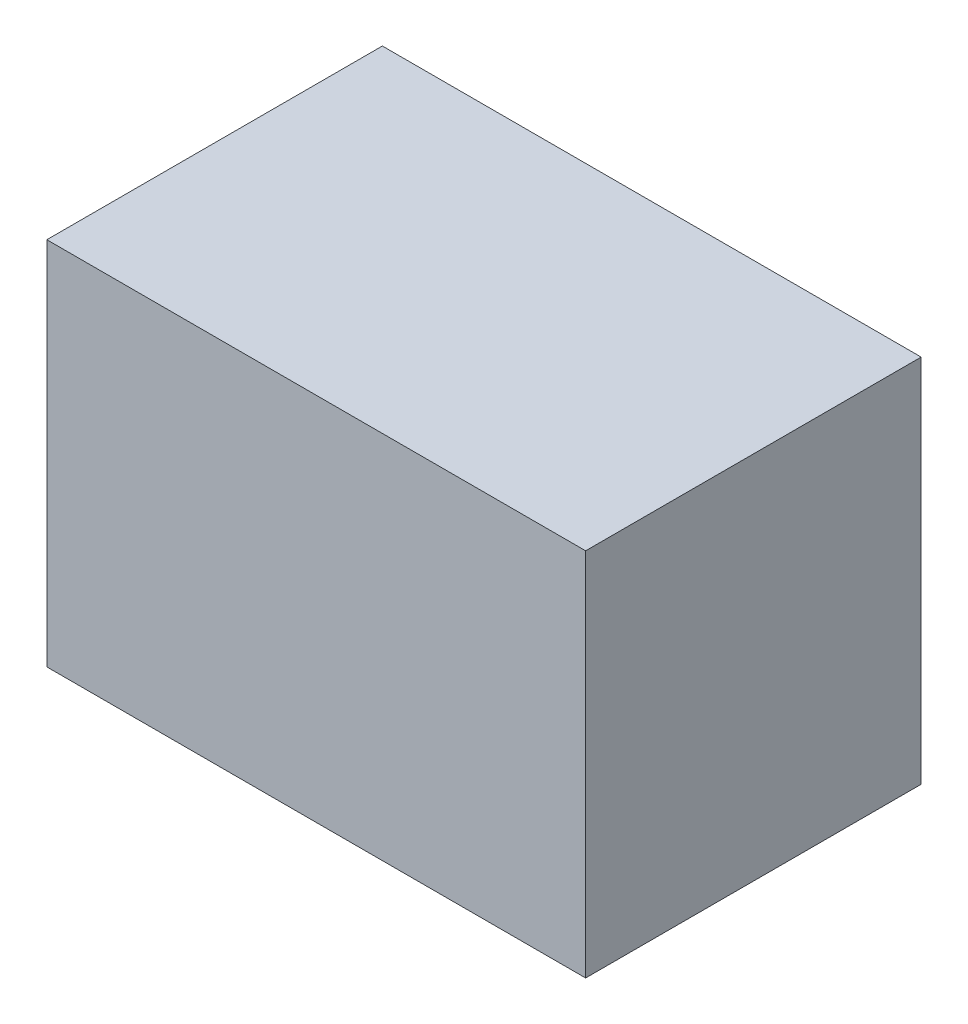
ISO-10303-21;
HEADER;
FILE_DESCRIPTION(('STEP AP214'),'2;1');
FILE_NAME('part.step','',(''),(''),'','','');
FILE_SCHEMA(('AUTOMOTIVE_DESIGN { 1 0 10303 214 1 1 1 1 }'));
ENDSEC;
DATA;
#1=APPLICATION_CONTEXT('core data for automotive mechanical design processes');
#2=APPLICATION_PROTOCOL_DEFINITION('international standard','automotive_design',2000,#1);
#3=PRODUCT_CONTEXT('',#1,'mechanical');
#4=PRODUCT('Part','Part','',(#3));
#5=PRODUCT_RELATED_PRODUCT_CATEGORY('part','',(#4));
#6=PRODUCT_DEFINITION_FORMATION('','',#4);
#7=PRODUCT_DEFINITION_CONTEXT('part definition',#1,'design');
#8=PRODUCT_DEFINITION('design','',#6,#7);
#9=PRODUCT_DEFINITION_SHAPE('','',#8);
#10=(LENGTH_UNIT() NAMED_UNIT(*) SI_UNIT(.MILLI.,.METRE.));
#11=(NAMED_UNIT(*) PLANE_ANGLE_UNIT() SI_UNIT($,.RADIAN.));
#12=(NAMED_UNIT(*) SI_UNIT($,.STERADIAN.) SOLID_ANGLE_UNIT());
#13=UNCERTAINTY_MEASURE_WITH_UNIT(LENGTH_MEASURE(1.E-05),#10,'distance_accuracy_value','');
#14=(GEOMETRIC_REPRESENTATION_CONTEXT(3) GLOBAL_UNCERTAINTY_ASSIGNED_CONTEXT((#13)) GLOBAL_UNIT_ASSIGNED_CONTEXT((#10,
#11,#12)) REPRESENTATION_CONTEXT('',''));
#15=CARTESIAN_POINT('',(0.,0.,0.));
#16=DIRECTION('',(0.,0.,1.));
#17=DIRECTION('',(1.,0.,0.));
#18=AXIS2_PLACEMENT_3D('',#15,#16,#17);
#19=CARTESIAN_POINT('',(3.87835769760427,9.77834466126577,0.));
#20=DIRECTION('',(1.,0.,0.));
#21=DIRECTION('',(0.,1.,0.));
#22=AXIS2_PLACEMENT_3D('',#19,#20,#21);
#23=PLANE('',#22);
#24=DIRECTION('',(0.,1.,0.));
#25=VECTOR('',#24,1.);
#26=CARTESIAN_POINT('',(3.87835769760427,8.45509735715968,0.));
#27=LINE('',#26,#25);
#28=CARTESIAN_POINT('',(3.87835769760427,8.45509735715968,0.));
#29=VERTEX_POINT('',#28);
#30=CARTESIAN_POINT('',(3.87835769760427,9.77834466126577,0.));
#31=VERTEX_POINT('',#30);
#32=EDGE_CURVE('E84',#29,#31,#27,.T.);
#33=ORIENTED_EDGE('',*,*,#32,.F.);
#34=DIRECTION('',(0.,0.,-1.));
#35=VECTOR('',#34,1.);
#36=CARTESIAN_POINT('',(3.87835769760427,8.45509735715968,0.));
#37=LINE('',#36,#35);
#38=CARTESIAN_POINT('',(3.87835769760427,8.45509735715968,-1.2));
#39=VERTEX_POINT('',#38);
#40=EDGE_CURVE('E67',#29,#39,#37,.T.);
#41=ORIENTED_EDGE('',*,*,#40,.T.);
#42=DIRECTION('',(0.,-1.,0.));
#43=VECTOR('',#42,1.);
#44=CARTESIAN_POINT('',(3.87835769760427,8.45509735715968,-1.2));
#45=LINE('',#44,#43);
#46=CARTESIAN_POINT('',(3.87835769760427,9.77834466126577,-1.2));
#47=VERTEX_POINT('',#46);
#48=EDGE_CURVE('E81',#47,#39,#45,.T.);
#49=ORIENTED_EDGE('',*,*,#48,.F.);
#50=DIRECTION('',(0.,0.,-1.));
#51=VECTOR('',#50,1.);
#52=CARTESIAN_POINT('',(3.87835769760427,9.77834466126577,0.));
#53=LINE('',#52,#51);
#54=EDGE_CURVE('E11',#31,#47,#53,.T.);
#55=ORIENTED_EDGE('',*,*,#54,.F.);
#56=EDGE_LOOP('',(#33,#41,#49,#55));
#57=FACE_BOUND('',#56,.T.);
#58=ADVANCED_FACE('F16',(#57),#23,.T.);
#59=CARTESIAN_POINT('',(1.95129851686723,9.77834466126577,0.));
#60=DIRECTION('',(0.,1.,0.));
#61=DIRECTION('',(1.,0.,0.));
#62=AXIS2_PLACEMENT_3D('',#59,#60,#61);
#63=PLANE('',#62);
#64=DIRECTION('',(-1.,0.,0.));
#65=VECTOR('',#64,1.);
#66=CARTESIAN_POINT('',(3.87835769760427,9.77834466126577,0.));
#67=LINE('',#66,#65);
#68=CARTESIAN_POINT('',(1.95129851686723,9.77834466126577,0.));
#69=VERTEX_POINT('',#68);
#70=EDGE_CURVE('E107',#31,#69,#67,.T.);
#71=ORIENTED_EDGE('',*,*,#70,.F.);
#72=ORIENTED_EDGE('',*,*,#54,.T.);
#73=DIRECTION('',(1.,0.,0.));
#74=VECTOR('',#73,1.);
#75=CARTESIAN_POINT('',(3.87835769760427,9.77834466126577,-1.2));
#76=LINE('',#75,#74);
#77=CARTESIAN_POINT('',(1.95129851686723,9.77834466126577,-1.2));
#78=VERTEX_POINT('',#77);
#79=EDGE_CURVE('E93',#78,#47,#76,.T.);
#80=ORIENTED_EDGE('',*,*,#79,.F.);
#81=DIRECTION('',(0.,0.,-1.));
#82=VECTOR('',#81,1.);
#83=CARTESIAN_POINT('',(1.95129851686723,9.77834466126577,0.));
#84=LINE('',#83,#82);
#85=EDGE_CURVE('E27',#69,#78,#84,.T.);
#86=ORIENTED_EDGE('',*,*,#85,.F.);
#87=EDGE_LOOP('',(#71,#72,#80,#86));
#88=FACE_BOUND('',#87,.T.);
#89=ADVANCED_FACE('F122',(#88),#63,.T.);
#90=CARTESIAN_POINT('',(1.95129851686723,8.45509735715968,0.));
#91=DIRECTION('',(-1.,0.,0.));
#92=DIRECTION('',(0.,0.,1.));
#93=AXIS2_PLACEMENT_3D('',#90,#91,#92);
#94=PLANE('',#93);
#95=DIRECTION('',(0.,-1.,0.));
#96=VECTOR('',#95,1.);
#97=CARTESIAN_POINT('',(1.95129851686723,9.77834466126577,0.));
#98=LINE('',#97,#96);
#99=CARTESIAN_POINT('',(1.95129851686723,8.45509735715968,0.));
#100=VERTEX_POINT('',#99);
#101=EDGE_CURVE('E98',#69,#100,#98,.T.);
#102=ORIENTED_EDGE('',*,*,#101,.F.);
#103=ORIENTED_EDGE('',*,*,#85,.T.);
#104=DIRECTION('',(0.,1.,0.));
#105=VECTOR('',#104,1.);
#106=CARTESIAN_POINT('',(1.95129851686723,9.77834466126577,-1.2));
#107=LINE('',#106,#105);
#108=CARTESIAN_POINT('',(1.95129851686723,8.45509735715968,-1.2));
#109=VERTEX_POINT('',#108);
#110=EDGE_CURVE('E97',#109,#78,#107,.T.);
#111=ORIENTED_EDGE('',*,*,#110,.F.);
#112=DIRECTION('',(0.,0.,-1.));
#113=VECTOR('',#112,1.);
#114=CARTESIAN_POINT('',(1.95129851686723,8.45509735715968,0.));
#115=LINE('',#114,#113);
#116=EDGE_CURVE('E20',#100,#109,#115,.T.);
#117=ORIENTED_EDGE('',*,*,#116,.F.);
#118=EDGE_LOOP('',(#102,#103,#111,#117));
#119=FACE_BOUND('',#118,.T.);
#120=ADVANCED_FACE('F120',(#119),#94,.T.);
#121=CARTESIAN_POINT('',(3.87835769760427,8.45509735715968,0.));
#122=DIRECTION('',(0.,-1.,0.));
#123=DIRECTION('',(0.,0.,-1.));
#124=AXIS2_PLACEMENT_3D('',#121,#122,#123);
#125=PLANE('',#124);
#126=DIRECTION('',(1.,0.,0.));
#127=VECTOR('',#126,1.);
#128=CARTESIAN_POINT('',(1.95129851686723,8.45509735715968,0.));
#129=LINE('',#128,#127);
#130=EDGE_CURVE('E112',#100,#29,#129,.T.);
#131=ORIENTED_EDGE('',*,*,#130,.F.);
#132=ORIENTED_EDGE('',*,*,#116,.T.);
#133=DIRECTION('',(-1.,0.,0.));
#134=VECTOR('',#133,1.);
#135=CARTESIAN_POINT('',(1.95129851686723,8.45509735715968,-1.2));
#136=LINE('',#135,#134);
#137=EDGE_CURVE('E92',#39,#109,#136,.T.);
#138=ORIENTED_EDGE('',*,*,#137,.F.);
#139=ORIENTED_EDGE('',*,*,#40,.F.);
#140=EDGE_LOOP('',(#131,#132,#138,#139));
#141=FACE_BOUND('',#140,.T.);
#142=ADVANCED_FACE('F95',(#141),#125,.T.);
#143=CARTESIAN_POINT('',(2.91482810723576,9.11672100921273,-1.2));
#144=DIRECTION('',(0.,0.,-1.));
#145=DIRECTION('',(0.,-1.,0.));
#146=AXIS2_PLACEMENT_3D('',#143,#144,#145);
#147=PLANE('',#146);
#148=ORIENTED_EDGE('',*,*,#137,.T.);
#149=ORIENTED_EDGE('',*,*,#110,.T.);
#150=ORIENTED_EDGE('',*,*,#79,.T.);
#151=ORIENTED_EDGE('',*,*,#48,.T.);
#152=EDGE_LOOP('',(#148,#149,#150,#151));
#153=FACE_BOUND('',#152,.T.);
#154=ADVANCED_FACE('F90',(#153),#147,.T.);
#155=CARTESIAN_POINT('',(2.91482810723576,9.11672100921273,0.));
#156=DIRECTION('',(0.,0.,-1.));
#157=DIRECTION('',(0.,-1.,0.));
#158=AXIS2_PLACEMENT_3D('',#155,#156,#157);
#159=PLANE('',#158);
#160=ORIENTED_EDGE('',*,*,#130,.T.);
#161=ORIENTED_EDGE('',*,*,#32,.T.);
#162=ORIENTED_EDGE('',*,*,#70,.T.);
#163=ORIENTED_EDGE('',*,*,#101,.T.);
#164=EDGE_LOOP('',(#160,#161,#162,#163));
#165=FACE_BOUND('',#164,.T.);
#166=ADVANCED_FACE('F18',(#165),#159,.F.);
#167=CLOSED_SHELL('',(#58,#89,#120,#142,#154,#166));
#168=MANIFOLD_SOLID_BREP('B1',#167);
#169=ADVANCED_BREP_SHAPE_REPRESENTATION('',(#18,#168),#14);
#170=SHAPE_DEFINITION_REPRESENTATION(#9,#169);
ENDSEC;
END-ISO-10303-21;
